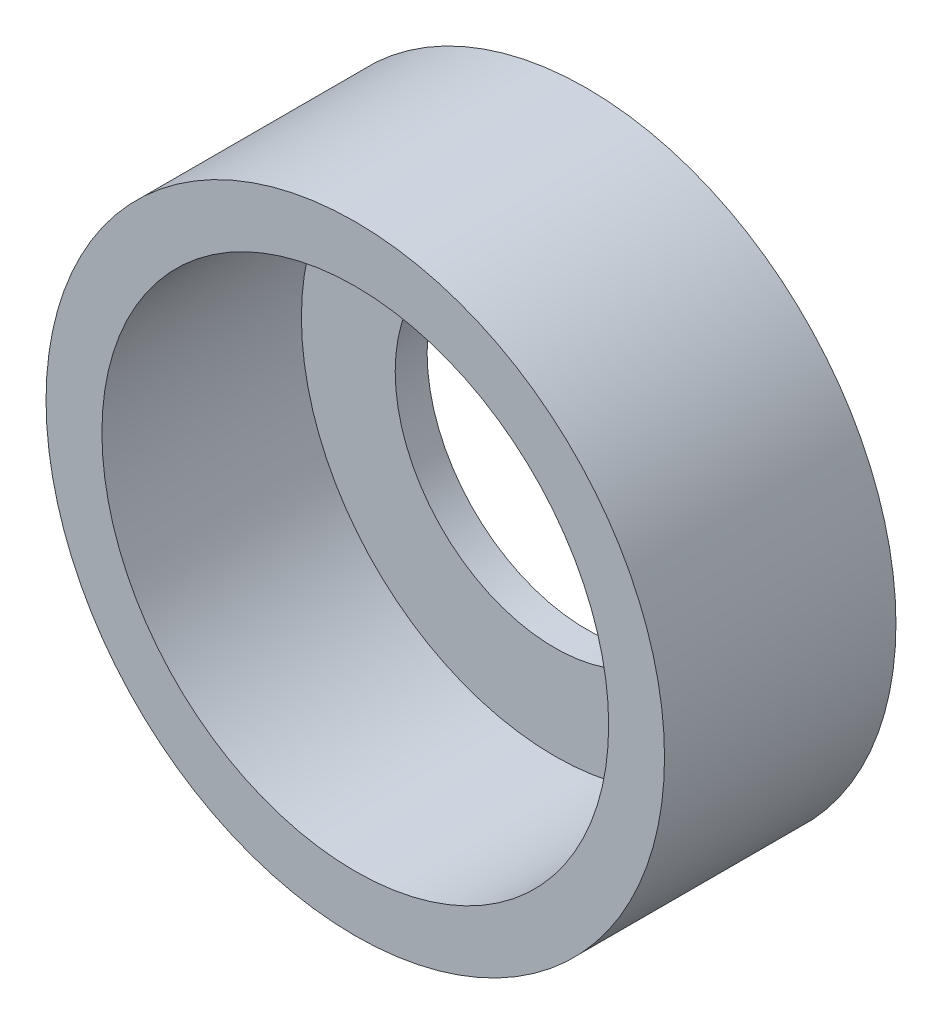
ISO-10303-21;
HEADER;
FILE_DESCRIPTION(('STEP AP214'),'2;1');
FILE_NAME('part.step','',(''),(''),'','','');
FILE_SCHEMA(('AUTOMOTIVE_DESIGN { 1 0 10303 214 1 1 1 1 }'));
ENDSEC;
DATA;
#1=APPLICATION_CONTEXT('core data for automotive mechanical design processes');
#2=APPLICATION_PROTOCOL_DEFINITION('international standard','automotive_design',2000,#1);
#3=PRODUCT_CONTEXT('',#1,'mechanical');
#4=PRODUCT('Part','Part','',(#3));
#5=PRODUCT_RELATED_PRODUCT_CATEGORY('part','',(#4));
#6=PRODUCT_DEFINITION_FORMATION('','',#4);
#7=PRODUCT_DEFINITION_CONTEXT('part definition',#1,'design');
#8=PRODUCT_DEFINITION('design','',#6,#7);
#9=PRODUCT_DEFINITION_SHAPE('','',#8);
#10=(LENGTH_UNIT() NAMED_UNIT(*) SI_UNIT(.MILLI.,.METRE.));
#11=(NAMED_UNIT(*) PLANE_ANGLE_UNIT() SI_UNIT($,.RADIAN.));
#12=(NAMED_UNIT(*) SI_UNIT($,.STERADIAN.) SOLID_ANGLE_UNIT());
#13=UNCERTAINTY_MEASURE_WITH_UNIT(LENGTH_MEASURE(1.E-05),#10,'distance_accuracy_value','');
#14=(GEOMETRIC_REPRESENTATION_CONTEXT(3) GLOBAL_UNCERTAINTY_ASSIGNED_CONTEXT((#13)) GLOBAL_UNIT_ASSIGNED_CONTEXT((#10,
#11,#12)) REPRESENTATION_CONTEXT('',''));
#15=CARTESIAN_POINT('',(0.,0.,0.));
#16=DIRECTION('',(0.,0.,1.));
#17=DIRECTION('',(1.,0.,0.));
#18=AXIS2_PLACEMENT_3D('',#15,#16,#17);
#19=CARTESIAN_POINT('',(0.,0.,0.4));
#20=DIRECTION('',(0.,0.,1.));
#21=DIRECTION('',(1.,0.,0.));
#22=AXIS2_PLACEMENT_3D('',#19,#20,#21);
#23=PLANE('',#22);
#24=CARTESIAN_POINT('',(0.,0.,0.4));
#25=DIRECTION('',(0.,0.,1.));
#26=DIRECTION('',(1.,0.,0.));
#27=AXIS2_PLACEMENT_3D('',#24,#25,#26);
#28=CIRCLE('',#27,2.);
#29=CARTESIAN_POINT('',(2.,0.,0.4));
#30=VERTEX_POINT('',#29);
#31=EDGE_CURVE('E56',#30,#30,#28,.T.);
#32=ORIENTED_EDGE('',*,*,#31,.F.);
#33=EDGE_LOOP('',(#32));
#34=FACE_BOUND('',#33,.T.);
#35=CARTESIAN_POINT('',(0.,0.,0.4));
#36=DIRECTION('',(0.,0.,1.));
#37=DIRECTION('',(1.,0.,0.));
#38=AXIS2_PLACEMENT_3D('',#35,#36,#37);
#39=CIRCLE('',#38,3.175);
#40=CARTESIAN_POINT('',(3.175,0.,0.4));
#41=VERTEX_POINT('',#40);
#42=EDGE_CURVE('E10',#41,#41,#39,.F.);
#43=ORIENTED_EDGE('',*,*,#42,.F.);
#44=EDGE_LOOP('',(#43));
#45=FACE_BOUND('',#44,.T.);
#46=ADVANCED_FACE('F43',(#34,#45),#23,.T.);
#47=CARTESIAN_POINT('',(0.,0.,0.));
#48=DIRECTION('',(0.,0.,1.));
#49=DIRECTION('',(1.,0.,0.));
#50=AXIS2_PLACEMENT_3D('',#47,#48,#49);
#51=PLANE('',#50);
#52=CARTESIAN_POINT('',(0.,0.,0.));
#53=DIRECTION('',(0.,0.,1.));
#54=DIRECTION('',(1.,0.,0.));
#55=AXIS2_PLACEMENT_3D('',#52,#53,#54);
#56=CIRCLE('',#55,3.875);
#57=CARTESIAN_POINT('',(3.875,0.,0.));
#58=VERTEX_POINT('',#57);
#59=EDGE_CURVE('E51',#58,#58,#56,.T.);
#60=ORIENTED_EDGE('',*,*,#59,.F.);
#61=EDGE_LOOP('',(#60));
#62=FACE_BOUND('',#61,.T.);
#63=CARTESIAN_POINT('',(0.,0.,0.));
#64=DIRECTION('',(0.,0.,1.));
#65=DIRECTION('',(1.,0.,0.));
#66=AXIS2_PLACEMENT_3D('',#63,#64,#65);
#67=CIRCLE('',#66,2.);
#68=CARTESIAN_POINT('',(2.,0.,0.));
#69=VERTEX_POINT('',#68);
#70=EDGE_CURVE('E61',#69,#69,#67,.T.);
#71=ORIENTED_EDGE('',*,*,#70,.T.);
#72=EDGE_LOOP('',(#71));
#73=FACE_BOUND('',#72,.T.);
#74=ADVANCED_FACE('F92',(#62,#73),#51,.F.);
#75=CARTESIAN_POINT('',(0.,0.,0.4));
#76=DIRECTION('',(0.,0.,-1.));
#77=DIRECTION('',(-1.,0.,0.));
#78=AXIS2_PLACEMENT_3D('',#75,#76,#77);
#79=CYLINDRICAL_SURFACE('',#78,3.875);
#80=ORIENTED_EDGE('',*,*,#59,.T.);
#81=EDGE_LOOP('',(#80));
#82=FACE_BOUND('',#81,.T.);
#83=CARTESIAN_POINT('',(0.,0.,2.9));
#84=DIRECTION('',(0.,0.,1.));
#85=DIRECTION('',(1.,0.,0.));
#86=AXIS2_PLACEMENT_3D('',#83,#84,#85);
#87=CIRCLE('',#86,3.875);
#88=CARTESIAN_POINT('',(3.875,0.,2.9));
#89=VERTEX_POINT('',#88);
#90=EDGE_CURVE('E66',#89,#89,#87,.T.);
#91=ORIENTED_EDGE('',*,*,#90,.F.);
#92=EDGE_LOOP('',(#91));
#93=FACE_BOUND('',#92,.T.);
#94=ADVANCED_FACE('F45',(#82,#93),#79,.T.);
#95=CARTESIAN_POINT('',(0.,0.,0.4));
#96=DIRECTION('',(0.,0.,-1.));
#97=DIRECTION('',(-1.,0.,0.));
#98=AXIS2_PLACEMENT_3D('',#95,#96,#97);
#99=CYLINDRICAL_SURFACE('',#98,2.);
#100=ORIENTED_EDGE('',*,*,#31,.T.);
#101=EDGE_LOOP('',(#100));
#102=FACE_BOUND('',#101,.T.);
#103=ORIENTED_EDGE('',*,*,#70,.F.);
#104=EDGE_LOOP('',(#103));
#105=FACE_BOUND('',#104,.T.);
#106=ADVANCED_FACE('F80',(#102,#105),#99,.F.);
#107=CARTESIAN_POINT('',(0.,0.,2.9));
#108=DIRECTION('',(0.,0.,1.));
#109=DIRECTION('',(1.,0.,0.));
#110=AXIS2_PLACEMENT_3D('',#107,#108,#109);
#111=PLANE('',#110);
#112=ORIENTED_EDGE('',*,*,#90,.T.);
#113=EDGE_LOOP('',(#112));
#114=FACE_BOUND('',#113,.T.);
#115=CARTESIAN_POINT('',(0.,0.,2.9));
#116=DIRECTION('',(0.,0.,1.));
#117=DIRECTION('',(1.,0.,0.));
#118=AXIS2_PLACEMENT_3D('',#115,#116,#117);
#119=CIRCLE('',#118,3.175);
#120=CARTESIAN_POINT('',(3.175,0.,2.9));
#121=VERTEX_POINT('',#120);
#122=EDGE_CURVE('E71',#121,#121,#119,.T.);
#123=ORIENTED_EDGE('',*,*,#122,.F.);
#124=EDGE_LOOP('',(#123));
#125=FACE_BOUND('',#124,.T.);
#126=ADVANCED_FACE('F78',(#114,#125),#111,.T.);
#127=CARTESIAN_POINT('',(0.,0.,2.9));
#128=DIRECTION('',(0.,0.,-1.));
#129=DIRECTION('',(-1.,0.,0.));
#130=AXIS2_PLACEMENT_3D('',#127,#128,#129);
#131=CYLINDRICAL_SURFACE('',#130,3.175);
#132=ORIENTED_EDGE('',*,*,#122,.T.);
#133=EDGE_LOOP('',(#132));
#134=FACE_BOUND('',#133,.T.);
#135=ORIENTED_EDGE('',*,*,#42,.T.);
#136=EDGE_LOOP('',(#135));
#137=FACE_BOUND('',#136,.T.);
#138=ADVANCED_FACE('F76',(#134,#137),#131,.F.);
#139=CLOSED_SHELL('',(#46,#74,#94,#106,#126,#138));
#140=MANIFOLD_SOLID_BREP('B2',#139);
#141=ADVANCED_BREP_SHAPE_REPRESENTATION('',(#18,#140),#14);
#142=SHAPE_DEFINITION_REPRESENTATION(#9,#141);
ENDSEC;
END-ISO-10303-21;
